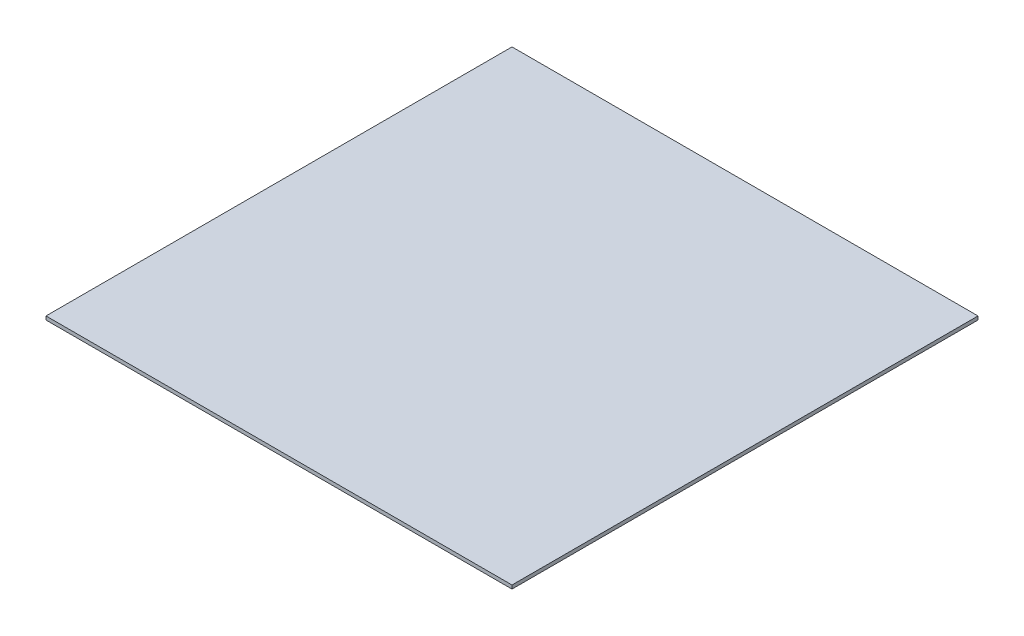
ISO-10303-21;
HEADER;
FILE_DESCRIPTION(('STEP AP214'),'2;1');
FILE_NAME('part.step','',(''),(''),'','','');
FILE_SCHEMA(('AUTOMOTIVE_DESIGN { 1 0 10303 214 1 1 1 1 }'));
ENDSEC;
DATA;
#1=APPLICATION_CONTEXT('core data for automotive mechanical design processes');
#2=APPLICATION_PROTOCOL_DEFINITION('international standard','automotive_design',2000,#1);
#3=PRODUCT_CONTEXT('',#1,'mechanical');
#4=PRODUCT('Part','Part','',(#3));
#5=PRODUCT_RELATED_PRODUCT_CATEGORY('part','',(#4));
#6=PRODUCT_DEFINITION_FORMATION('','',#4);
#7=PRODUCT_DEFINITION_CONTEXT('part definition',#1,'design');
#8=PRODUCT_DEFINITION('design','',#6,#7);
#9=PRODUCT_DEFINITION_SHAPE('','',#8);
#10=(LENGTH_UNIT() NAMED_UNIT(*) SI_UNIT(.MILLI.,.METRE.));
#11=(NAMED_UNIT(*) PLANE_ANGLE_UNIT() SI_UNIT($,.RADIAN.));
#12=(NAMED_UNIT(*) SI_UNIT($,.STERADIAN.) SOLID_ANGLE_UNIT());
#13=UNCERTAINTY_MEASURE_WITH_UNIT(LENGTH_MEASURE(1.E-05),#10,'distance_accuracy_value','');
#14=(GEOMETRIC_REPRESENTATION_CONTEXT(3) GLOBAL_UNCERTAINTY_ASSIGNED_CONTEXT((#13)) GLOBAL_UNIT_ASSIGNED_CONTEXT((#10,
#11,#12)) REPRESENTATION_CONTEXT('',''));
#15=CARTESIAN_POINT('',(0.,0.,0.));
#16=DIRECTION('',(0.,0.,1.));
#17=DIRECTION('',(1.,0.,0.));
#18=AXIS2_PLACEMENT_3D('',#15,#16,#17);
#19=CARTESIAN_POINT('',(-130.,2.,130.));
#20=DIRECTION('',(0.,0.,-1.));
#21=DIRECTION('',(-1.,0.,0.));
#22=AXIS2_PLACEMENT_3D('',#19,#20,#21);
#23=PLANE('',#22);
#24=DIRECTION('',(1.,0.,0.));
#25=VECTOR('',#24,1.);
#26=CARTESIAN_POINT('',(-130.,0.,130.));
#27=LINE('',#26,#25);
#28=CARTESIAN_POINT('',(-130.,0.,130.));
#29=VERTEX_POINT('',#28);
#30=CARTESIAN_POINT('',(130.,0.,130.));
#31=VERTEX_POINT('',#30);
#32=EDGE_CURVE('E100',#29,#31,#27,.T.);
#33=ORIENTED_EDGE('',*,*,#32,.T.);
#34=DIRECTION('',(0.,-1.,0.));
#35=VECTOR('',#34,1.);
#36=CARTESIAN_POINT('',(130.,2.,130.));
#37=LINE('',#36,#35);
#38=CARTESIAN_POINT('',(130.,2.,130.));
#39=VERTEX_POINT('',#38);
#40=EDGE_CURVE('E11',#39,#31,#37,.T.);
#41=ORIENTED_EDGE('',*,*,#40,.F.);
#42=DIRECTION('',(1.,0.,0.));
#43=VECTOR('',#42,1.);
#44=CARTESIAN_POINT('',(-130.,2.,130.));
#45=LINE('',#44,#43);
#46=CARTESIAN_POINT('',(-130.,2.,130.));
#47=VERTEX_POINT('',#46);
#48=EDGE_CURVE('E86',#47,#39,#45,.T.);
#49=ORIENTED_EDGE('',*,*,#48,.F.);
#50=DIRECTION('',(0.,-1.,0.));
#51=VECTOR('',#50,1.);
#52=CARTESIAN_POINT('',(-130.,2.,130.));
#53=LINE('',#52,#51);
#54=EDGE_CURVE('E53',#47,#29,#53,.T.);
#55=ORIENTED_EDGE('',*,*,#54,.T.);
#56=EDGE_LOOP('',(#33,#41,#49,#55));
#57=FACE_BOUND('',#56,.T.);
#58=ADVANCED_FACE('F37',(#57),#23,.F.);
#59=CARTESIAN_POINT('',(130.,2.,130.));
#60=DIRECTION('',(-1.,0.,0.));
#61=DIRECTION('',(0.,0.,1.));
#62=AXIS2_PLACEMENT_3D('',#59,#60,#61);
#63=PLANE('',#62);
#64=DIRECTION('',(0.,0.,-1.));
#65=VECTOR('',#64,1.);
#66=CARTESIAN_POINT('',(130.,0.,130.));
#67=LINE('',#66,#65);
#68=CARTESIAN_POINT('',(130.,0.,-130.));
#69=VERTEX_POINT('',#68);
#70=EDGE_CURVE('E91',#31,#69,#67,.T.);
#71=ORIENTED_EDGE('',*,*,#70,.T.);
#72=DIRECTION('',(0.,-1.,0.));
#73=VECTOR('',#72,1.);
#74=CARTESIAN_POINT('',(130.,2.,-130.));
#75=LINE('',#74,#73);
#76=CARTESIAN_POINT('',(130.,2.,-130.));
#77=VERTEX_POINT('',#76);
#78=EDGE_CURVE('E45',#77,#69,#75,.T.);
#79=ORIENTED_EDGE('',*,*,#78,.F.);
#80=DIRECTION('',(0.,0.,-1.));
#81=VECTOR('',#80,1.);
#82=CARTESIAN_POINT('',(130.,2.,130.));
#83=LINE('',#82,#81);
#84=EDGE_CURVE('E78',#39,#77,#83,.T.);
#85=ORIENTED_EDGE('',*,*,#84,.F.);
#86=ORIENTED_EDGE('',*,*,#40,.T.);
#87=EDGE_LOOP('',(#71,#79,#85,#86));
#88=FACE_BOUND('',#87,.T.);
#89=ADVANCED_FACE('F90',(#88),#63,.F.);
#90=CARTESIAN_POINT('',(-130.,2.,-130.));
#91=DIRECTION('',(0.,0.,-1.));
#92=DIRECTION('',(-1.,0.,0.));
#93=AXIS2_PLACEMENT_3D('',#90,#91,#92);
#94=PLANE('',#93);
#95=DIRECTION('',(1.,0.,0.));
#96=VECTOR('',#95,1.);
#97=CARTESIAN_POINT('',(-130.,0.,-130.));
#98=LINE('',#97,#96);
#99=CARTESIAN_POINT('',(-130.,0.,-130.));
#100=VERTEX_POINT('',#99);
#101=EDGE_CURVE('E103',#100,#69,#98,.T.);
#102=ORIENTED_EDGE('',*,*,#101,.F.);
#103=DIRECTION('',(0.,-1.,0.));
#104=VECTOR('',#103,1.);
#105=CARTESIAN_POINT('',(-130.,2.,-130.));
#106=LINE('',#105,#104);
#107=CARTESIAN_POINT('',(-130.,2.,-130.));
#108=VERTEX_POINT('',#107);
#109=EDGE_CURVE('E67',#108,#100,#106,.T.);
#110=ORIENTED_EDGE('',*,*,#109,.F.);
#111=DIRECTION('',(1.,0.,0.));
#112=VECTOR('',#111,1.);
#113=CARTESIAN_POINT('',(-130.,2.,-130.));
#114=LINE('',#113,#112);
#115=EDGE_CURVE('E85',#108,#77,#114,.T.);
#116=ORIENTED_EDGE('',*,*,#115,.T.);
#117=ORIENTED_EDGE('',*,*,#78,.T.);
#118=EDGE_LOOP('',(#102,#110,#116,#117));
#119=FACE_BOUND('',#118,.T.);
#120=ADVANCED_FACE('F94',(#119),#94,.T.);
#121=CARTESIAN_POINT('',(-130.,2.,130.));
#122=DIRECTION('',(-1.,0.,0.));
#123=DIRECTION('',(0.,0.,1.));
#124=AXIS2_PLACEMENT_3D('',#121,#122,#123);
#125=PLANE('',#124);
#126=DIRECTION('',(0.,0.,-1.));
#127=VECTOR('',#126,1.);
#128=CARTESIAN_POINT('',(-130.,0.,130.));
#129=LINE('',#128,#127);
#130=EDGE_CURVE('E105',#29,#100,#129,.T.);
#131=ORIENTED_EDGE('',*,*,#130,.F.);
#132=ORIENTED_EDGE('',*,*,#54,.F.);
#133=DIRECTION('',(0.,0.,-1.));
#134=VECTOR('',#133,1.);
#135=CARTESIAN_POINT('',(-130.,2.,130.));
#136=LINE('',#135,#134);
#137=EDGE_CURVE('E95',#47,#108,#136,.T.);
#138=ORIENTED_EDGE('',*,*,#137,.T.);
#139=ORIENTED_EDGE('',*,*,#109,.T.);
#140=EDGE_LOOP('',(#131,#132,#138,#139));
#141=FACE_BOUND('',#140,.T.);
#142=ADVANCED_FACE('F111',(#141),#125,.T.);
#143=CARTESIAN_POINT('',(0.,2.,0.));
#144=DIRECTION('',(0.,1.,0.));
#145=DIRECTION('',(0.,0.,1.));
#146=AXIS2_PLACEMENT_3D('',#143,#144,#145);
#147=PLANE('',#146);
#148=ORIENTED_EDGE('',*,*,#48,.T.);
#149=ORIENTED_EDGE('',*,*,#84,.T.);
#150=ORIENTED_EDGE('',*,*,#115,.F.);
#151=ORIENTED_EDGE('',*,*,#137,.F.);
#152=EDGE_LOOP('',(#148,#149,#150,#151));
#153=FACE_BOUND('',#152,.T.);
#154=ADVANCED_FACE('F82',(#153),#147,.T.);
#155=CARTESIAN_POINT('',(0.,0.,0.));
#156=DIRECTION('',(0.,1.,0.));
#157=DIRECTION('',(0.,0.,1.));
#158=AXIS2_PLACEMENT_3D('',#155,#156,#157);
#159=PLANE('',#158);
#160=ORIENTED_EDGE('',*,*,#32,.F.);
#161=ORIENTED_EDGE('',*,*,#130,.T.);
#162=ORIENTED_EDGE('',*,*,#101,.T.);
#163=ORIENTED_EDGE('',*,*,#70,.F.);
#164=EDGE_LOOP('',(#160,#161,#162,#163));
#165=FACE_BOUND('',#164,.T.);
#166=ADVANCED_FACE('F110',(#165),#159,.F.);
#167=CLOSED_SHELL('',(#58,#89,#120,#142,#154,#166));
#168=MANIFOLD_SOLID_BREP('B2',#167);
#169=ADVANCED_BREP_SHAPE_REPRESENTATION('',(#18,#168),#14);
#170=SHAPE_DEFINITION_REPRESENTATION(#9,#169);
ENDSEC;
END-ISO-10303-21;
